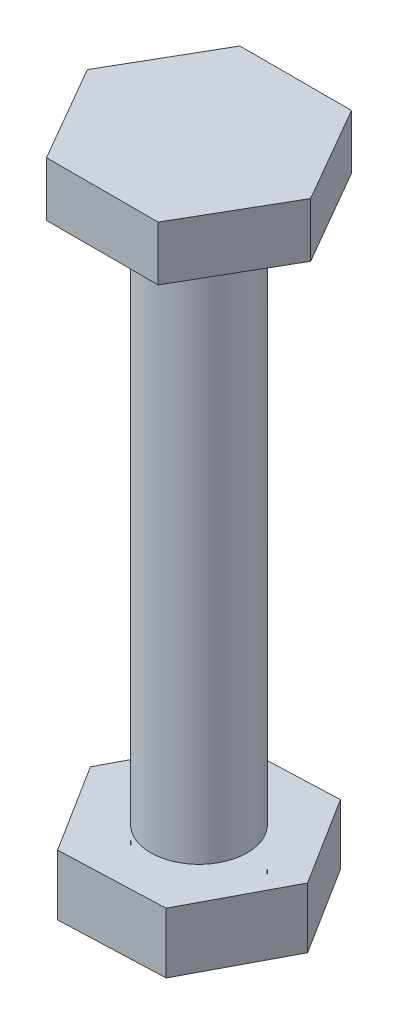
ISO-10303-21;
HEADER;
FILE_DESCRIPTION(('STEP AP214'),'2;1');
FILE_NAME('part.step','',(''),(''),'','','');
FILE_SCHEMA(('AUTOMOTIVE_DESIGN { 1 0 10303 214 1 1 1 1 }'));
ENDSEC;
DATA;
#1=APPLICATION_CONTEXT('core data for automotive mechanical design processes');
#2=APPLICATION_PROTOCOL_DEFINITION('international standard','automotive_design',2000,#1);
#3=PRODUCT_CONTEXT('',#1,'mechanical');
#4=PRODUCT('Part','Part','',(#3));
#5=PRODUCT_RELATED_PRODUCT_CATEGORY('part','',(#4));
#6=PRODUCT_DEFINITION_FORMATION('','',#4);
#7=PRODUCT_DEFINITION_CONTEXT('part definition',#1,'design');
#8=PRODUCT_DEFINITION('design','',#6,#7);
#9=PRODUCT_DEFINITION_SHAPE('','',#8);
#10=(LENGTH_UNIT() NAMED_UNIT(*) SI_UNIT(.MILLI.,.METRE.));
#11=(NAMED_UNIT(*) PLANE_ANGLE_UNIT() SI_UNIT($,.RADIAN.));
#12=(NAMED_UNIT(*) SI_UNIT($,.STERADIAN.) SOLID_ANGLE_UNIT());
#13=UNCERTAINTY_MEASURE_WITH_UNIT(LENGTH_MEASURE(1.E-05),#10,'distance_accuracy_value','');
#14=(GEOMETRIC_REPRESENTATION_CONTEXT(3) GLOBAL_UNCERTAINTY_ASSIGNED_CONTEXT((#13)) GLOBAL_UNIT_ASSIGNED_CONTEXT((#10,
#11,#12)) REPRESENTATION_CONTEXT('',''));
#15=CARTESIAN_POINT('',(0.,0.,0.));
#16=DIRECTION('',(0.,0.,1.));
#17=DIRECTION('',(1.,0.,0.));
#18=AXIS2_PLACEMENT_3D('',#15,#16,#17);
#19=CARTESIAN_POINT('',(-18.060687683867,-45.,-7.65967068703795));
#20=DIRECTION('',(0.846328372807622,0.,-0.532661511075095));
#21=DIRECTION('',(-0.532661511075095,0.,-0.846328372807622));
#22=AXIS2_PLACEMENT_3D('',#19,#20,#21);
#23=PLANE('',#22);
#24=DIRECTION('',(0.532661511075095,0.,0.846328372807622));
#25=VECTOR('',#24,1.);
#26=CARTESIAN_POINT('',(-18.060687683867,-50.,-7.65967068703795));
#27=LINE('',#26,#25);
#28=CARTESIAN_POINT('',(-18.060687683867,-50.,-7.65967068703795));
#29=VERTEX_POINT('',#28);
#30=CARTESIAN_POINT('',(-13.4477036817746,-50.,-0.330251979088484));
#31=VERTEX_POINT('',#30);
#32=EDGE_CURVE('E128',#29,#31,#27,.T.);
#33=ORIENTED_EDGE('',*,*,#32,.F.);
#34=DIRECTION('',(0.,-1.,0.));
#35=VECTOR('',#34,1.);
#36=CARTESIAN_POINT('',(-18.060687683867,-45.,-7.65967068703795));
#37=LINE('',#36,#35);
#38=CARTESIAN_POINT('',(-18.060687683867,-45.,-7.65967068703795));
#39=VERTEX_POINT('',#38);
#40=EDGE_CURVE('E12',#39,#29,#37,.T.);
#41=ORIENTED_EDGE('',*,*,#40,.F.);
#42=DIRECTION('',(0.532661511075095,0.,0.846328372807622));
#43=VECTOR('',#42,1.);
#44=CARTESIAN_POINT('',(-18.060687683867,-45.,-7.65967068703795));
#45=LINE('',#44,#43);
#46=CARTESIAN_POINT('',(-13.4477036817746,-45.,-0.330251979088484));
#47=VERTEX_POINT('',#46);
#48=EDGE_CURVE('E142',#39,#47,#45,.T.);
#49=ORIENTED_EDGE('',*,*,#48,.T.);
#50=DIRECTION('',(0.,-1.,0.));
#51=VECTOR('',#50,1.);
#52=CARTESIAN_POINT('',(-13.4477036817746,-45.,-0.330251979088484));
#53=LINE('',#52,#51);
#54=EDGE_CURVE('E46',#47,#31,#53,.T.);
#55=ORIENTED_EDGE('',*,*,#54,.T.);
#56=EDGE_LOOP('',(#33,#41,#49,#55));
#57=FACE_BOUND('',#56,.T.);
#58=ADVANCED_FACE('F43',(#57),#23,.T.);
#59=CARTESIAN_POINT('',(-26.7146424809704,-45.,-7.32941870794947));
#60=DIRECTION('',(-0.0381342138054279,0.,-0.999272626332495));
#61=DIRECTION('',(-0.999272626332495,0.,0.0381342138054279));
#62=AXIS2_PLACEMENT_3D('',#59,#60,#61);
#63=PLANE('',#62);
#64=DIRECTION('',(0.999272626332495,0.,-0.0381342138054279));
#65=VECTOR('',#64,1.);
#66=CARTESIAN_POINT('',(-26.7146424809704,-50.,-7.32941870794947));
#67=LINE('',#66,#65);
#68=CARTESIAN_POINT('',(-26.7146424809704,-50.,-7.32941870794947));
#69=VERTEX_POINT('',#68);
#70=EDGE_CURVE('E140',#69,#29,#67,.T.);
#71=ORIENTED_EDGE('',*,*,#70,.F.);
#72=DIRECTION('',(0.,-1.,0.));
#73=VECTOR('',#72,1.);
#74=CARTESIAN_POINT('',(-26.7146424809704,-45.,-7.32941870794947));
#75=LINE('',#74,#73);
#76=CARTESIAN_POINT('',(-26.7146424809704,-45.,-7.32941870794947));
#77=VERTEX_POINT('',#76);
#78=EDGE_CURVE('E52',#77,#69,#75,.T.);
#79=ORIENTED_EDGE('',*,*,#78,.F.);
#80=DIRECTION('',(0.999272626332495,0.,-0.0381342138054279));
#81=VECTOR('',#80,1.);
#82=CARTESIAN_POINT('',(-26.7146424809704,-45.,-7.32941870794947));
#83=LINE('',#82,#81);
#84=EDGE_CURVE('E118',#77,#39,#83,.T.);
#85=ORIENTED_EDGE('',*,*,#84,.T.);
#86=ORIENTED_EDGE('',*,*,#40,.T.);
#87=EDGE_LOOP('',(#71,#79,#85,#86));
#88=FACE_BOUND('',#87,.T.);
#89=ADVANCED_FACE('F150',(#88),#63,.T.);
#90=CARTESIAN_POINT('',(-30.7556132759813,-45.,0.330251979088486));
#91=DIRECTION('',(-0.884462586613049,0.,-0.4666111152574));
#92=DIRECTION('',(-0.4666111152574,0.,0.884462586613049));
#93=AXIS2_PLACEMENT_3D('',#90,#91,#92);
#94=PLANE('',#93);
#95=DIRECTION('',(0.4666111152574,0.,-0.884462586613049));
#96=VECTOR('',#95,1.);
#97=CARTESIAN_POINT('',(-30.7556132759813,-50.,0.330251979088486));
#98=LINE('',#97,#96);
#99=CARTESIAN_POINT('',(-30.7556132759813,-50.,0.330251979088486));
#100=VERTEX_POINT('',#99);
#101=EDGE_CURVE('E105',#100,#69,#98,.T.);
#102=ORIENTED_EDGE('',*,*,#101,.F.);
#103=DIRECTION('',(0.,-1.,0.));
#104=VECTOR('',#103,1.);
#105=CARTESIAN_POINT('',(-30.7556132759813,-45.,0.330251979088486));
#106=LINE('',#105,#104);
#107=CARTESIAN_POINT('',(-30.7556132759813,-45.,0.330251979088486));
#108=VERTEX_POINT('',#107);
#109=EDGE_CURVE('E100',#108,#100,#106,.T.);
#110=ORIENTED_EDGE('',*,*,#109,.F.);
#111=DIRECTION('',(0.4666111152574,0.,-0.884462586613049));
#112=VECTOR('',#111,1.);
#113=CARTESIAN_POINT('',(-30.7556132759813,-45.,0.330251979088486));
#114=LINE('',#113,#112);
#115=EDGE_CURVE('E103',#108,#77,#114,.T.);
#116=ORIENTED_EDGE('',*,*,#115,.T.);
#117=ORIENTED_EDGE('',*,*,#78,.T.);
#118=EDGE_LOOP('',(#102,#110,#116,#117));
#119=FACE_BOUND('',#118,.T.);
#120=ADVANCED_FACE('F102',(#119),#94,.T.);
#121=CARTESIAN_POINT('',(-26.1426292738889,-45.,7.65967068703796));
#122=DIRECTION('',(-0.846328372807621,0.,0.532661511075095));
#123=DIRECTION('',(0.532661511075095,0.,0.846328372807621));
#124=AXIS2_PLACEMENT_3D('',#121,#122,#123);
#125=PLANE('',#124);
#126=DIRECTION('',(-0.532661511075095,0.,-0.846328372807621));
#127=VECTOR('',#126,1.);
#128=CARTESIAN_POINT('',(-26.1426292738889,-50.,7.65967068703796));
#129=LINE('',#128,#127);
#130=CARTESIAN_POINT('',(-26.1426292738889,-50.,7.65967068703796));
#131=VERTEX_POINT('',#130);
#132=EDGE_CURVE('E137',#131,#100,#129,.T.);
#133=ORIENTED_EDGE('',*,*,#132,.F.);
#134=DIRECTION('',(0.,-1.,0.));
#135=VECTOR('',#134,1.);
#136=CARTESIAN_POINT('',(-26.1426292738889,-45.,7.65967068703796));
#137=LINE('',#136,#135);
#138=CARTESIAN_POINT('',(-26.1426292738889,-45.,7.65967068703796));
#139=VERTEX_POINT('',#138);
#140=EDGE_CURVE('E110',#139,#131,#137,.T.);
#141=ORIENTED_EDGE('',*,*,#140,.F.);
#142=DIRECTION('',(-0.532661511075095,0.,-0.846328372807621));
#143=VECTOR('',#142,1.);
#144=CARTESIAN_POINT('',(-26.1426292738889,-45.,7.65967068703796));
#145=LINE('',#144,#143);
#146=EDGE_CURVE('E116',#139,#108,#145,.T.);
#147=ORIENTED_EDGE('',*,*,#146,.T.);
#148=ORIENTED_EDGE('',*,*,#109,.T.);
#149=EDGE_LOOP('',(#133,#141,#147,#148));
#150=FACE_BOUND('',#149,.T.);
#151=ADVANCED_FACE('F120',(#150),#125,.T.);
#152=CARTESIAN_POINT('',(-17.4886744767856,-45.,7.32941870794948));
#153=DIRECTION('',(0.0381342138054279,0.,0.999272626332495));
#154=DIRECTION('',(0.999272626332495,0.,-0.0381342138054279));
#155=AXIS2_PLACEMENT_3D('',#152,#153,#154);
#156=PLANE('',#155);
#157=DIRECTION('',(-0.999272626332495,0.,0.0381342138054279));
#158=VECTOR('',#157,1.);
#159=CARTESIAN_POINT('',(-17.4886744767856,-50.,7.32941870794948));
#160=LINE('',#159,#158);
#161=CARTESIAN_POINT('',(-17.4886744767856,-50.,7.32941870794948));
#162=VERTEX_POINT('',#161);
#163=EDGE_CURVE('E134',#162,#131,#160,.T.);
#164=ORIENTED_EDGE('',*,*,#163,.F.);
#165=DIRECTION('',(0.,-1.,0.));
#166=VECTOR('',#165,1.);
#167=CARTESIAN_POINT('',(-17.4886744767856,-45.,7.32941870794948));
#168=LINE('',#167,#166);
#169=CARTESIAN_POINT('',(-17.4886744767856,-45.,7.32941870794948));
#170=VERTEX_POINT('',#169);
#171=EDGE_CURVE('E145',#170,#162,#168,.T.);
#172=ORIENTED_EDGE('',*,*,#171,.F.);
#173=DIRECTION('',(-0.999272626332495,0.,0.0381342138054279));
#174=VECTOR('',#173,1.);
#175=CARTESIAN_POINT('',(-17.4886744767856,-45.,7.32941870794948));
#176=LINE('',#175,#174);
#177=EDGE_CURVE('E121',#170,#139,#176,.T.);
#178=ORIENTED_EDGE('',*,*,#177,.T.);
#179=ORIENTED_EDGE('',*,*,#140,.T.);
#180=EDGE_LOOP('',(#164,#172,#178,#179));
#181=FACE_BOUND('',#180,.T.);
#182=ADVANCED_FACE('F163',(#181),#156,.T.);
#183=CARTESIAN_POINT('',(-13.4477036817746,-45.,-0.330251979088484));
#184=DIRECTION('',(0.884462586613049,0.,0.4666111152574));
#185=DIRECTION('',(0.4666111152574,0.,-0.884462586613049));
#186=AXIS2_PLACEMENT_3D('',#183,#184,#185);
#187=PLANE('',#186);
#188=DIRECTION('',(-0.4666111152574,0.,0.884462586613049));
#189=VECTOR('',#188,1.);
#190=CARTESIAN_POINT('',(-13.4477036817746,-50.,-0.330251979088484));
#191=LINE('',#190,#189);
#192=EDGE_CURVE('E131',#31,#162,#191,.T.);
#193=ORIENTED_EDGE('',*,*,#192,.F.);
#194=ORIENTED_EDGE('',*,*,#54,.F.);
#195=DIRECTION('',(-0.4666111152574,0.,0.884462586613049));
#196=VECTOR('',#195,1.);
#197=CARTESIAN_POINT('',(-13.4477036817746,-45.,-0.330251979088484));
#198=LINE('',#197,#196);
#199=EDGE_CURVE('E123',#47,#170,#198,.T.);
#200=ORIENTED_EDGE('',*,*,#199,.T.);
#201=ORIENTED_EDGE('',*,*,#171,.T.);
#202=EDGE_LOOP('',(#193,#194,#200,#201));
#203=FACE_BOUND('',#202,.T.);
#204=ADVANCED_FACE('F147',(#203),#187,.T.);
#205=CARTESIAN_POINT('',(-13.4477036817746,-45.,-0.330251979088483));
#206=DIRECTION('',(0.,-1.,0.));
#207=DIRECTION('',(0.,0.,-1.));
#208=AXIS2_PLACEMENT_3D('',#205,#206,#207);
#209=PLANE('',#208);
#210=ORIENTED_EDGE('',*,*,#48,.F.);
#211=ORIENTED_EDGE('',*,*,#84,.F.);
#212=ORIENTED_EDGE('',*,*,#115,.F.);
#213=ORIENTED_EDGE('',*,*,#146,.F.);
#214=ORIENTED_EDGE('',*,*,#177,.F.);
#215=ORIENTED_EDGE('',*,*,#199,.F.);
#216=EDGE_LOOP('',(#210,#211,#212,#213,#214,#215));
#217=FACE_BOUND('',#216,.T.);
#218=ADVANCED_FACE('F114',(#217),#209,.F.);
#219=CARTESIAN_POINT('',(-13.4477036817746,-50.,-0.330251979088483));
#220=DIRECTION('',(0.,-1.,0.));
#221=DIRECTION('',(0.,0.,-1.));
#222=AXIS2_PLACEMENT_3D('',#219,#220,#221);
#223=PLANE('',#222);
#224=ORIENTED_EDGE('',*,*,#32,.T.);
#225=ORIENTED_EDGE('',*,*,#192,.T.);
#226=ORIENTED_EDGE('',*,*,#163,.T.);
#227=ORIENTED_EDGE('',*,*,#132,.T.);
#228=ORIENTED_EDGE('',*,*,#101,.T.);
#229=ORIENTED_EDGE('',*,*,#70,.T.);
#230=EDGE_LOOP('',(#224,#225,#226,#227,#228,#229));
#231=FACE_BOUND('',#230,.T.);
#232=ADVANCED_FACE('F149',(#231),#223,.T.);
#233=CLOSED_SHELL('',(#58,#89,#120,#151,#182,#204,#218,#232));
#234=MANIFOLD_SOLID_BREP('B2',#233);
#235=CARTESIAN_POINT('',(-12.8640541718439,0.,0.));
#236=DIRECTION('',(0.,1.,0.));
#237=DIRECTION('',(0.,0.,1.));
#238=AXIS2_PLACEMENT_3D('',#235,#236,#237);
#239=PLANE('',#238);
#240=DIRECTION('',(0.5,0.,-0.866025403784439));
#241=VECTOR('',#240,1.);
#242=CARTESIAN_POINT('',(-17.4828563253609,0.,7.99999999999999));
#243=LINE('',#242,#241);
#244=CARTESIAN_POINT('',(-17.4828563253609,0.,7.99999999999999));
#245=VERTEX_POINT('',#244);
#246=CARTESIAN_POINT('',(-12.8640541718439,0.,0.));
#247=VERTEX_POINT('',#246);
#248=EDGE_CURVE('E305',#245,#247,#243,.T.);
#249=ORIENTED_EDGE('',*,*,#248,.F.);
#250=DIRECTION('',(1.,0.,0.));
#251=VECTOR('',#250,1.);
#252=CARTESIAN_POINT('',(-26.720460632395,0.,8.));
#253=LINE('',#252,#251);
#254=CARTESIAN_POINT('',(-26.720460632395,0.,8.));
#255=VERTEX_POINT('',#254);
#256=EDGE_CURVE('E265',#255,#245,#253,.T.);
#257=ORIENTED_EDGE('',*,*,#256,.F.);
#258=DIRECTION('',(0.5,0.,0.866025403784439));
#259=VECTOR('',#258,1.);
#260=CARTESIAN_POINT('',(-31.339262785912,0.,0.));
#261=LINE('',#260,#259);
#262=CARTESIAN_POINT('',(-31.339262785912,0.,0.));
#263=VERTEX_POINT('',#262);
#264=EDGE_CURVE('E259',#263,#255,#261,.T.);
#265=ORIENTED_EDGE('',*,*,#264,.F.);
#266=DIRECTION('',(-0.5,0.,0.866025403784439));
#267=VECTOR('',#266,1.);
#268=CARTESIAN_POINT('',(-26.720460632395,0.,-8.00000000000001));
#269=LINE('',#268,#267);
#270=CARTESIAN_POINT('',(-26.720460632395,0.,-8.00000000000001));
#271=VERTEX_POINT('',#270);
#272=EDGE_CURVE('E295',#271,#263,#269,.T.);
#273=ORIENTED_EDGE('',*,*,#272,.F.);
#274=DIRECTION('',(-1.,0.,0.));
#275=VECTOR('',#274,1.);
#276=CARTESIAN_POINT('',(-17.482856325361,0.,-8.00000000000001));
#277=LINE('',#276,#275);
#278=CARTESIAN_POINT('',(-17.482856325361,0.,-8.00000000000001));
#279=VERTEX_POINT('',#278);
#280=EDGE_CURVE('E311',#279,#271,#277,.T.);
#281=ORIENTED_EDGE('',*,*,#280,.F.);
#282=DIRECTION('',(-0.5,0.,-0.866025403784439));
#283=VECTOR('',#282,1.);
#284=CARTESIAN_POINT('',(-12.8640541718439,0.,0.));
#285=LINE('',#284,#283);
#286=EDGE_CURVE('E308',#247,#279,#285,.T.);
#287=ORIENTED_EDGE('',*,*,#286,.F.);
#288=EDGE_LOOP('',(#249,#257,#265,#273,#281,#287));
#289=FACE_BOUND('',#288,.T.);
#290=CARTESIAN_POINT('',(-22.101658478878,0.,0.));
#291=DIRECTION('',(0.,1.,0.));
#292=DIRECTION('',(0.,0.,1.));
#293=AXIS2_PLACEMENT_3D('',#290,#291,#292);
#294=CIRCLE('',#293,4.);
#295=CARTESIAN_POINT('',(-22.101658478878,0.,4.));
#296=VERTEX_POINT('',#295);
#297=EDGE_CURVE('E41',#296,#296,#294,.F.);
#298=ORIENTED_EDGE('',*,*,#297,.F.);
#299=EDGE_LOOP('',(#298));
#300=FACE_BOUND('',#299,.T.);
#301=ADVANCED_FACE('F219',(#289,#300),#239,.F.);
#302=CARTESIAN_POINT('',(-17.4828563253609,4.5,7.99999999999999));
#303=DIRECTION('',(-0.866025403784439,0.,-0.5));
#304=DIRECTION('',(-0.5,0.,0.866025403784439));
#305=AXIS2_PLACEMENT_3D('',#302,#303,#304);
#306=PLANE('',#305);
#307=ORIENTED_EDGE('',*,*,#248,.T.);
#308=DIRECTION('',(0.,-1.,0.));
#309=VECTOR('',#308,1.);
#310=CARTESIAN_POINT('',(-12.8640541718439,4.5,0.));
#311=LINE('',#310,#309);
#312=CARTESIAN_POINT('',(-12.8640541718439,4.5,0.));
#313=VERTEX_POINT('',#312);
#314=EDGE_CURVE('E228',#313,#247,#311,.T.);
#315=ORIENTED_EDGE('',*,*,#314,.F.);
#316=DIRECTION('',(0.5,0.,-0.866025403784439));
#317=VECTOR('',#316,1.);
#318=CARTESIAN_POINT('',(-17.4828563253609,4.5,7.99999999999999));
#319=LINE('',#318,#317);
#320=CARTESIAN_POINT('',(-17.4828563253609,4.5,7.99999999999999));
#321=VERTEX_POINT('',#320);
#322=EDGE_CURVE('E316',#321,#313,#319,.T.);
#323=ORIENTED_EDGE('',*,*,#322,.F.);
#324=DIRECTION('',(0.,-1.,0.));
#325=VECTOR('',#324,1.);
#326=CARTESIAN_POINT('',(-17.4828563253609,4.5,7.99999999999999));
#327=LINE('',#326,#325);
#328=EDGE_CURVE('E301',#321,#245,#327,.T.);
#329=ORIENTED_EDGE('',*,*,#328,.T.);
#330=EDGE_LOOP('',(#307,#315,#323,#329));
#331=FACE_BOUND('',#330,.T.);
#332=ADVANCED_FACE('F221',(#331),#306,.F.);
#333=CARTESIAN_POINT('',(-12.8640541718439,4.5,0.));
#334=DIRECTION('',(-0.866025403784439,0.,0.5));
#335=DIRECTION('',(0.5,0.,0.866025403784439));
#336=AXIS2_PLACEMENT_3D('',#333,#334,#335);
#337=PLANE('',#336);
#338=ORIENTED_EDGE('',*,*,#286,.T.);
#339=DIRECTION('',(0.,-1.,0.));
#340=VECTOR('',#339,1.);
#341=CARTESIAN_POINT('',(-17.482856325361,4.5,-8.00000000000001));
#342=LINE('',#341,#340);
#343=CARTESIAN_POINT('',(-17.482856325361,4.5,-8.00000000000001));
#344=VERTEX_POINT('',#343);
#345=EDGE_CURVE('E320',#344,#279,#342,.T.);
#346=ORIENTED_EDGE('',*,*,#345,.F.);
#347=DIRECTION('',(-0.5,0.,-0.866025403784439));
#348=VECTOR('',#347,1.);
#349=CARTESIAN_POINT('',(-12.8640541718439,4.5,0.));
#350=LINE('',#349,#348);
#351=EDGE_CURVE('E274',#313,#344,#350,.T.);
#352=ORIENTED_EDGE('',*,*,#351,.F.);
#353=ORIENTED_EDGE('',*,*,#314,.T.);
#354=EDGE_LOOP('',(#338,#346,#352,#353));
#355=FACE_BOUND('',#354,.T.);
#356=ADVANCED_FACE('F323',(#355),#337,.F.);
#357=CARTESIAN_POINT('',(-17.482856325361,4.5,-8.00000000000001));
#358=DIRECTION('',(0.,0.,1.));
#359=DIRECTION('',(1.,0.,0.));
#360=AXIS2_PLACEMENT_3D('',#357,#358,#359);
#361=PLANE('',#360);
#362=ORIENTED_EDGE('',*,*,#280,.T.);
#363=DIRECTION('',(0.,-1.,0.));
#364=VECTOR('',#363,1.);
#365=CARTESIAN_POINT('',(-26.720460632395,4.5,-8.00000000000001));
#366=LINE('',#365,#364);
#367=CARTESIAN_POINT('',(-26.720460632395,4.5,-8.00000000000001));
#368=VERTEX_POINT('',#367);
#369=EDGE_CURVE('E296',#368,#271,#366,.T.);
#370=ORIENTED_EDGE('',*,*,#369,.F.);
#371=DIRECTION('',(-1.,0.,0.));
#372=VECTOR('',#371,1.);
#373=CARTESIAN_POINT('',(-17.482856325361,4.5,-8.00000000000001));
#374=LINE('',#373,#372);
#375=EDGE_CURVE('E287',#344,#368,#374,.T.);
#376=ORIENTED_EDGE('',*,*,#375,.F.);
#377=ORIENTED_EDGE('',*,*,#345,.T.);
#378=EDGE_LOOP('',(#362,#370,#376,#377));
#379=FACE_BOUND('',#378,.T.);
#380=ADVANCED_FACE('F331',(#379),#361,.F.);
#381=CARTESIAN_POINT('',(-26.720460632395,4.5,-8.00000000000001));
#382=DIRECTION('',(0.866025403784439,0.,0.5));
#383=DIRECTION('',(0.5,0.,-0.866025403784439));
#384=AXIS2_PLACEMENT_3D('',#381,#382,#383);
#385=PLANE('',#384);
#386=ORIENTED_EDGE('',*,*,#272,.T.);
#387=DIRECTION('',(0.,-1.,0.));
#388=VECTOR('',#387,1.);
#389=CARTESIAN_POINT('',(-31.339262785912,4.5,0.));
#390=LINE('',#389,#388);
#391=CARTESIAN_POINT('',(-31.339262785912,4.5,0.));
#392=VERTEX_POINT('',#391);
#393=EDGE_CURVE('E292',#392,#263,#390,.T.);
#394=ORIENTED_EDGE('',*,*,#393,.F.);
#395=DIRECTION('',(-0.5,0.,0.866025403784439));
#396=VECTOR('',#395,1.);
#397=CARTESIAN_POINT('',(-26.720460632395,4.5,-8.00000000000001));
#398=LINE('',#397,#396);
#399=EDGE_CURVE('E281',#368,#392,#398,.T.);
#400=ORIENTED_EDGE('',*,*,#399,.F.);
#401=ORIENTED_EDGE('',*,*,#369,.T.);
#402=EDGE_LOOP('',(#386,#394,#400,#401));
#403=FACE_BOUND('',#402,.T.);
#404=ADVANCED_FACE('F293',(#403),#385,.F.);
#405=CARTESIAN_POINT('',(-31.339262785912,4.5,0.));
#406=DIRECTION('',(0.866025403784439,0.,-0.5));
#407=DIRECTION('',(-0.5,0.,-0.866025403784439));
#408=AXIS2_PLACEMENT_3D('',#405,#406,#407);
#409=PLANE('',#408);
#410=ORIENTED_EDGE('',*,*,#264,.T.);
#411=DIRECTION('',(0.,-1.,0.));
#412=VECTOR('',#411,1.);
#413=CARTESIAN_POINT('',(-26.720460632395,4.5,8.));
#414=LINE('',#413,#412);
#415=CARTESIAN_POINT('',(-26.720460632395,4.5,8.));
#416=VERTEX_POINT('',#415);
#417=EDGE_CURVE('E297',#416,#255,#414,.T.);
#418=ORIENTED_EDGE('',*,*,#417,.F.);
#419=DIRECTION('',(0.5,0.,0.866025403784439));
#420=VECTOR('',#419,1.);
#421=CARTESIAN_POINT('',(-31.339262785912,4.5,0.));
#422=LINE('',#421,#420);
#423=EDGE_CURVE('E285',#392,#416,#422,.T.);
#424=ORIENTED_EDGE('',*,*,#423,.F.);
#425=ORIENTED_EDGE('',*,*,#393,.T.);
#426=EDGE_LOOP('',(#410,#418,#424,#425));
#427=FACE_BOUND('',#426,.T.);
#428=ADVANCED_FACE('F299',(#427),#409,.F.);
#429=CARTESIAN_POINT('',(-26.720460632395,4.5,8.));
#430=DIRECTION('',(0.,0.,-1.));
#431=DIRECTION('',(-1.,0.,0.));
#432=AXIS2_PLACEMENT_3D('',#429,#430,#431);
#433=PLANE('',#432);
#434=ORIENTED_EDGE('',*,*,#256,.T.);
#435=ORIENTED_EDGE('',*,*,#328,.F.);
#436=DIRECTION('',(1.,0.,0.));
#437=VECTOR('',#436,1.);
#438=CARTESIAN_POINT('',(-26.720460632395,4.5,8.));
#439=LINE('',#438,#437);
#440=EDGE_CURVE('E236',#416,#321,#439,.T.);
#441=ORIENTED_EDGE('',*,*,#440,.F.);
#442=ORIENTED_EDGE('',*,*,#417,.T.);
#443=EDGE_LOOP('',(#434,#435,#441,#442));
#444=FACE_BOUND('',#443,.T.);
#445=ADVANCED_FACE('F352',(#444),#433,.F.);
#446=CARTESIAN_POINT('',(-12.8640541718439,4.5,0.));
#447=DIRECTION('',(0.,1.,0.));
#448=DIRECTION('',(0.,0.,1.));
#449=AXIS2_PLACEMENT_3D('',#446,#447,#448);
#450=PLANE('',#449);
#451=ORIENTED_EDGE('',*,*,#322,.T.);
#452=ORIENTED_EDGE('',*,*,#351,.T.);
#453=ORIENTED_EDGE('',*,*,#375,.T.);
#454=ORIENTED_EDGE('',*,*,#399,.T.);
#455=ORIENTED_EDGE('',*,*,#423,.T.);
#456=ORIENTED_EDGE('',*,*,#440,.T.);
#457=EDGE_LOOP('',(#451,#452,#453,#454,#455,#456));
#458=FACE_BOUND('',#457,.T.);
#459=ADVANCED_FACE('F283',(#458),#450,.T.);
#460=CARTESIAN_POINT('',(-22.101658478878,-50.,0.));
#461=DIRECTION('',(0.,1.,0.));
#462=DIRECTION('',(0.,0.,1.));
#463=AXIS2_PLACEMENT_3D('',#460,#461,#462);
#464=CYLINDRICAL_SURFACE('',#463,4.);
#465=CARTESIAN_POINT('',(-22.101658478878,-50.,0.));
#466=DIRECTION('',(0.,-1.,0.));
#467=DIRECTION('',(0.,0.,-1.));
#468=AXIS2_PLACEMENT_3D('',#465,#466,#467);
#469=CIRCLE('',#468,4.);
#470=CARTESIAN_POINT('',(-22.101658478878,-50.,-4.));
#471=VERTEX_POINT('',#470);
#472=EDGE_CURVE('E309',#471,#471,#469,.T.);
#473=ORIENTED_EDGE('',*,*,#472,.F.);
#474=EDGE_LOOP('',(#473));
#475=FACE_BOUND('',#474,.T.);
#476=ORIENTED_EDGE('',*,*,#297,.T.);
#477=EDGE_LOOP('',(#476));
#478=FACE_BOUND('',#477,.T.);
#479=ADVANCED_FACE('F340',(#475,#478),#464,.T.);
#480=CARTESIAN_POINT('',(-22.101658478878,-50.,0.));
#481=DIRECTION('',(0.,-1.,0.));
#482=DIRECTION('',(0.,0.,-1.));
#483=AXIS2_PLACEMENT_3D('',#480,#481,#482);
#484=PLANE('',#483);
#485=ORIENTED_EDGE('',*,*,#472,.T.);
#486=EDGE_LOOP('',(#485));
#487=FACE_BOUND('',#486,.T.);
#488=ADVANCED_FACE('F338',(#487),#484,.T.);
#489=CLOSED_SHELL('',(#301,#332,#356,#380,#404,#428,#445,#459,#479,#488));
#490=MANIFOLD_SOLID_BREP('B6',#489);
#491=ADVANCED_BREP_SHAPE_REPRESENTATION('',(#18,#234,#490),#14);
#492=SHAPE_DEFINITION_REPRESENTATION(#9,#491);
ENDSEC;
END-ISO-10303-21;
